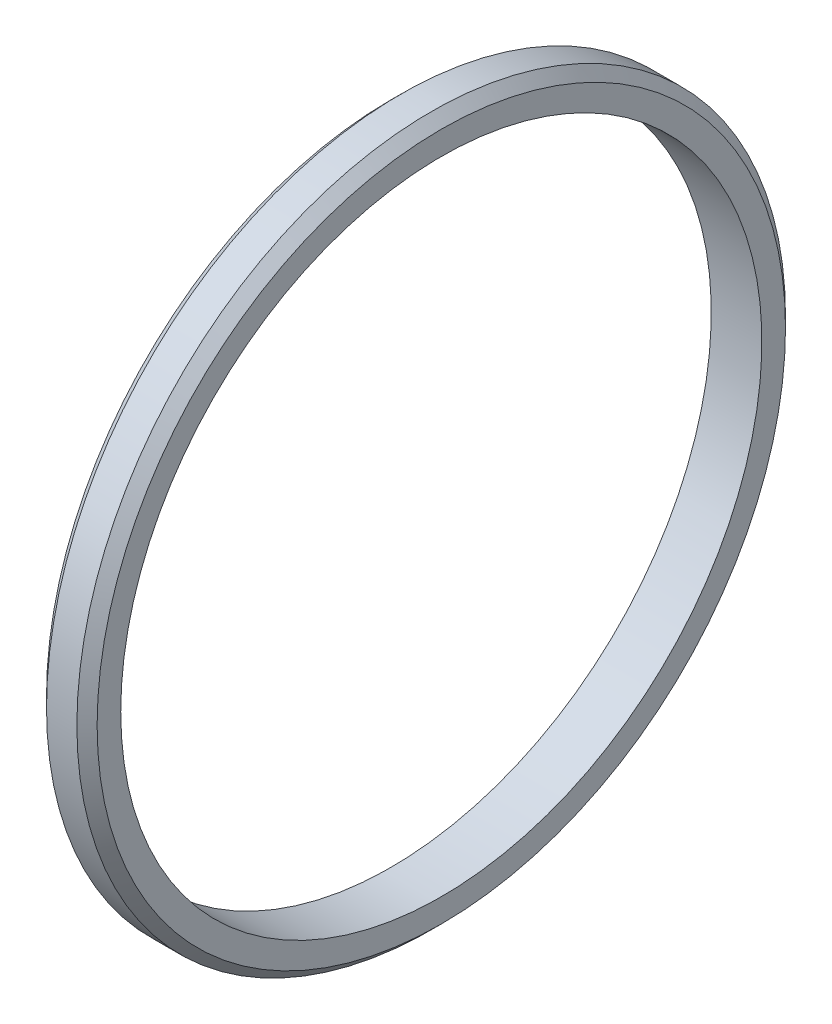
ISO-10303-21;
HEADER;
FILE_DESCRIPTION(('STEP AP214'),'2;1');
FILE_NAME('part.step','',(''),(''),'','','');
FILE_SCHEMA(('AUTOMOTIVE_DESIGN { 1 0 10303 214 1 1 1 1 }'));
ENDSEC;
DATA;
#1=APPLICATION_CONTEXT('core data for automotive mechanical design processes');
#2=APPLICATION_PROTOCOL_DEFINITION('international standard','automotive_design',2000,#1);
#3=PRODUCT_CONTEXT('',#1,'mechanical');
#4=PRODUCT('Part','Part','',(#3));
#5=PRODUCT_RELATED_PRODUCT_CATEGORY('part','',(#4));
#6=PRODUCT_DEFINITION_FORMATION('','',#4);
#7=PRODUCT_DEFINITION_CONTEXT('part definition',#1,'design');
#8=PRODUCT_DEFINITION('design','',#6,#7);
#9=PRODUCT_DEFINITION_SHAPE('','',#8);
#10=(LENGTH_UNIT() NAMED_UNIT(*) SI_UNIT(.MILLI.,.METRE.));
#11=(NAMED_UNIT(*) PLANE_ANGLE_UNIT() SI_UNIT($,.RADIAN.));
#12=(NAMED_UNIT(*) SI_UNIT($,.STERADIAN.) SOLID_ANGLE_UNIT());
#13=UNCERTAINTY_MEASURE_WITH_UNIT(LENGTH_MEASURE(1.E-05),#10,'distance_accuracy_value','');
#14=(GEOMETRIC_REPRESENTATION_CONTEXT(3) GLOBAL_UNCERTAINTY_ASSIGNED_CONTEXT((#13)) GLOBAL_UNIT_ASSIGNED_CONTEXT((#10,
#11,#12)) REPRESENTATION_CONTEXT('',''));
#15=CARTESIAN_POINT('',(0.,0.,0.));
#16=DIRECTION('',(0.,0.,1.));
#17=DIRECTION('',(1.,0.,0.));
#18=AXIS2_PLACEMENT_3D('',#15,#16,#17);
#19=CARTESIAN_POINT('',(0.,21.,0.));
#20=DIRECTION('',(1.,0.,0.));
#21=DIRECTION('',(0.,0.,-1.));
#22=AXIS2_PLACEMENT_3D('',#19,#20,#21);
#23=PLANE('',#22);
#24=CARTESIAN_POINT('',(0.,0.,0.));
#25=DIRECTION('',(1.,0.,0.));
#26=DIRECTION('',(0.,0.,-1.));
#27=AXIS2_PLACEMENT_3D('',#24,#25,#26);
#28=CIRCLE('',#27,20.4);
#29=CARTESIAN_POINT('',(0.,0.,-20.4));
#30=VERTEX_POINT('',#29);
#31=EDGE_CURVE('E48',#30,#30,#28,.F.);
#32=ORIENTED_EDGE('',*,*,#31,.T.);
#33=EDGE_LOOP('',(#32));
#34=FACE_BOUND('',#33,.T.);
#35=CARTESIAN_POINT('',(0.,0.,0.));
#36=DIRECTION('',(-1.,0.,0.));
#37=DIRECTION('',(0.,0.,1.));
#38=AXIS2_PLACEMENT_3D('',#35,#36,#37);
#39=CIRCLE('',#38,19.);
#40=CARTESIAN_POINT('',(0.,0.,19.));
#41=VERTEX_POINT('',#40);
#42=EDGE_CURVE('E53',#41,#41,#39,.T.);
#43=ORIENTED_EDGE('',*,*,#42,.F.);
#44=EDGE_LOOP('',(#43));
#45=FACE_BOUND('',#44,.T.);
#46=ADVANCED_FACE('F33',(#34,#45),#23,.F.);
#47=CARTESIAN_POINT('',(0.,0.,0.));
#48=DIRECTION('',(-1.,0.,0.));
#49=DIRECTION('',(0.,0.,1.));
#50=AXIS2_PLACEMENT_3D('',#47,#48,#49);
#51=CYLINDRICAL_SURFACE('',#50,19.);
#52=CARTESIAN_POINT('',(3.,0.,0.));
#53=DIRECTION('',(-1.,0.,0.));
#54=DIRECTION('',(0.,0.,1.));
#55=AXIS2_PLACEMENT_3D('',#52,#53,#54);
#56=CIRCLE('',#55,19.);
#57=CARTESIAN_POINT('',(3.,0.,19.));
#58=VERTEX_POINT('',#57);
#59=EDGE_CURVE('E56',#58,#58,#56,.T.);
#60=ORIENTED_EDGE('',*,*,#59,.F.);
#61=EDGE_LOOP('',(#60));
#62=FACE_BOUND('',#61,.T.);
#63=ORIENTED_EDGE('',*,*,#42,.T.);
#64=EDGE_LOOP('',(#63));
#65=FACE_BOUND('',#64,.T.);
#66=ADVANCED_FACE('F62',(#62,#65),#51,.F.);
#67=CARTESIAN_POINT('',(3.,19.,0.));
#68=DIRECTION('',(-1.,0.,0.));
#69=DIRECTION('',(0.,0.,1.));
#70=AXIS2_PLACEMENT_3D('',#67,#68,#69);
#71=PLANE('',#70);
#72=CARTESIAN_POINT('',(3.,0.,0.));
#73=DIRECTION('',(-1.,0.,0.));
#74=DIRECTION('',(0.,0.,1.));
#75=AXIS2_PLACEMENT_3D('',#72,#73,#74);
#76=CIRCLE('',#75,20.4);
#77=CARTESIAN_POINT('',(3.,0.,20.4));
#78=VERTEX_POINT('',#77);
#79=EDGE_CURVE('E10',#78,#78,#76,.F.);
#80=ORIENTED_EDGE('',*,*,#79,.T.);
#81=EDGE_LOOP('',(#80));
#82=FACE_BOUND('',#81,.T.);
#83=ORIENTED_EDGE('',*,*,#59,.T.);
#84=EDGE_LOOP('',(#83));
#85=FACE_BOUND('',#84,.T.);
#86=ADVANCED_FACE('F60',(#82,#85),#71,.F.);
#87=CARTESIAN_POINT('',(0.,0.,0.));
#88=DIRECTION('',(-1.,0.,0.));
#89=DIRECTION('',(0.,0.,1.));
#90=AXIS2_PLACEMENT_3D('',#87,#88,#89);
#91=CYLINDRICAL_SURFACE('',#90,21.);
#92=CARTESIAN_POINT('',(0.59999999999999,0.,0.));
#93=DIRECTION('',(1.,0.,0.));
#94=DIRECTION('',(0.,0.,-1.));
#95=AXIS2_PLACEMENT_3D('',#92,#93,#94);
#96=CIRCLE('',#95,21.);
#97=CARTESIAN_POINT('',(0.59999999999999,0.,-21.));
#98=VERTEX_POINT('',#97);
#99=EDGE_CURVE('E40',#98,#98,#96,.T.);
#100=ORIENTED_EDGE('',*,*,#99,.T.);
#101=EDGE_LOOP('',(#100));
#102=FACE_BOUND('',#101,.T.);
#103=CARTESIAN_POINT('',(2.4,0.,0.));
#104=DIRECTION('',(-1.,0.,0.));
#105=DIRECTION('',(0.,0.,1.));
#106=AXIS2_PLACEMENT_3D('',#103,#104,#105);
#107=CIRCLE('',#106,21.);
#108=CARTESIAN_POINT('',(2.4,0.,21.));
#109=VERTEX_POINT('',#108);
#110=EDGE_CURVE('E44',#109,#109,#107,.T.);
#111=ORIENTED_EDGE('',*,*,#110,.T.);
#112=EDGE_LOOP('',(#111));
#113=FACE_BOUND('',#112,.T.);
#114=ADVANCED_FACE('F76',(#102,#113),#91,.T.);
#115=CARTESIAN_POINT('',(0.,0.,0.));
#116=DIRECTION('',(1.,0.,0.));
#117=DIRECTION('',(0.,0.,-1.));
#118=AXIS2_PLACEMENT_3D('',#115,#116,#117);
#119=CONICAL_SURFACE('',#118,20.4,0.785398163397448);
#120=ORIENTED_EDGE('',*,*,#99,.F.);
#121=EDGE_LOOP('',(#120));
#122=FACE_BOUND('',#121,.T.);
#123=ORIENTED_EDGE('',*,*,#31,.F.);
#124=EDGE_LOOP('',(#123));
#125=FACE_BOUND('',#124,.T.);
#126=ADVANCED_FACE('F74',(#122,#125),#119,.T.);
#127=CARTESIAN_POINT('',(2.4,0.,0.));
#128=DIRECTION('',(-1.,0.,0.));
#129=DIRECTION('',(0.,0.,1.));
#130=AXIS2_PLACEMENT_3D('',#127,#128,#129);
#131=CONICAL_SURFACE('',#130,21.,0.785398163397451);
#132=ORIENTED_EDGE('',*,*,#79,.F.);
#133=EDGE_LOOP('',(#132));
#134=FACE_BOUND('',#133,.T.);
#135=ORIENTED_EDGE('',*,*,#110,.F.);
#136=EDGE_LOOP('',(#135));
#137=FACE_BOUND('',#136,.T.);
#138=ADVANCED_FACE('F35',(#134,#137),#131,.T.);
#139=CLOSED_SHELL('',(#46,#66,#86,#114,#126,#138));
#140=MANIFOLD_SOLID_BREP('B2',#139);
#141=ADVANCED_BREP_SHAPE_REPRESENTATION('',(#18,#140),#14);
#142=SHAPE_DEFINITION_REPRESENTATION(#9,#141);
ENDSEC;
END-ISO-10303-21;
